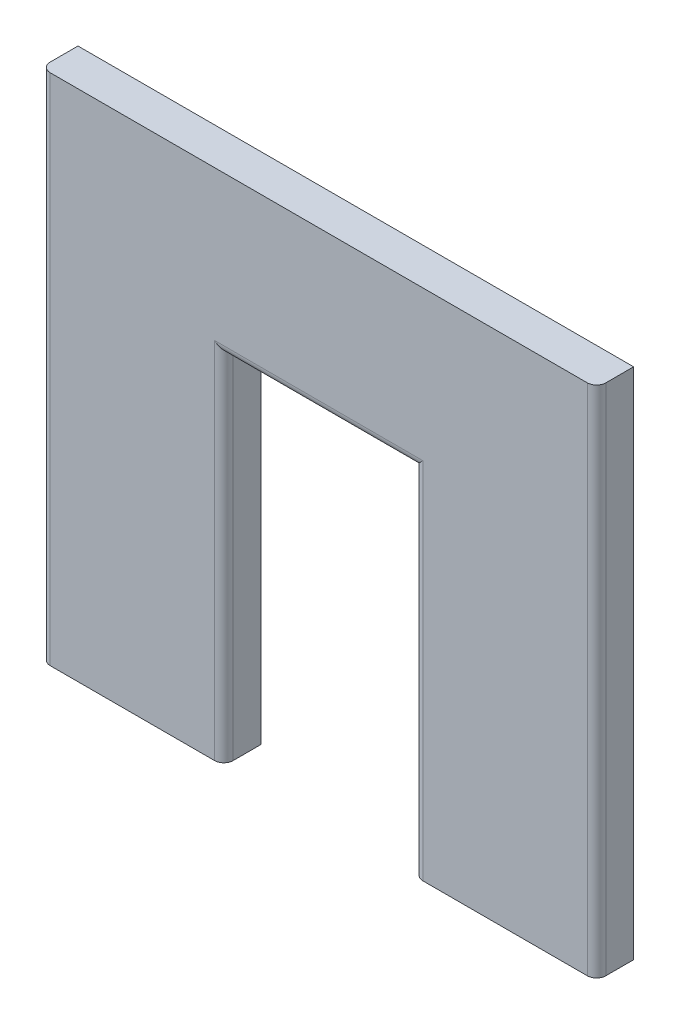
ISO-10303-21;
HEADER;
FILE_DESCRIPTION(('STEP AP214'),'2;1');
FILE_NAME('part.step','',(''),(''),'','','');
FILE_SCHEMA(('AUTOMOTIVE_DESIGN { 1 0 10303 214 1 1 1 1 }'));
ENDSEC;
DATA;
#1=APPLICATION_CONTEXT('core data for automotive mechanical design processes');
#2=APPLICATION_PROTOCOL_DEFINITION('international standard','automotive_design',2000,#1);
#3=PRODUCT_CONTEXT('',#1,'mechanical');
#4=PRODUCT('Part','Part','',(#3));
#5=PRODUCT_RELATED_PRODUCT_CATEGORY('part','',(#4));
#6=PRODUCT_DEFINITION_FORMATION('','',#4);
#7=PRODUCT_DEFINITION_CONTEXT('part definition',#1,'design');
#8=PRODUCT_DEFINITION('design','',#6,#7);
#9=PRODUCT_DEFINITION_SHAPE('','',#8);
#10=(LENGTH_UNIT() NAMED_UNIT(*) SI_UNIT(.MILLI.,.METRE.));
#11=(NAMED_UNIT(*) PLANE_ANGLE_UNIT() SI_UNIT($,.RADIAN.));
#12=(NAMED_UNIT(*) SI_UNIT($,.STERADIAN.) SOLID_ANGLE_UNIT());
#13=UNCERTAINTY_MEASURE_WITH_UNIT(LENGTH_MEASURE(1.E-05),#10,'distance_accuracy_value','');
#14=(GEOMETRIC_REPRESENTATION_CONTEXT(3) GLOBAL_UNCERTAINTY_ASSIGNED_CONTEXT((#13)) GLOBAL_UNIT_ASSIGNED_CONTEXT((#10,
#11,#12)) REPRESENTATION_CONTEXT('',''));
#15=CARTESIAN_POINT('',(0.,0.,0.));
#16=DIRECTION('',(0.,0.,1.));
#17=DIRECTION('',(1.,0.,0.));
#18=AXIS2_PLACEMENT_3D('',#15,#16,#17);
#19=CARTESIAN_POINT('',(-15.,-13.8636363636364,2.));
#20=DIRECTION('',(0.,1.,0.));
#21=DIRECTION('',(0.,0.,1.));
#22=AXIS2_PLACEMENT_3D('',#19,#20,#21);
#23=PLANE('',#22);
#24=DIRECTION('',(0.,0.,1.));
#25=VECTOR('',#24,1.);
#26=CARTESIAN_POINT('',(-5.12444720417668,-13.8636363636364,2.));
#27=LINE('',#26,#25);
#28=CARTESIAN_POINT('',(-5.12444720417668,-13.8636363636364,0.));
#29=VERTEX_POINT('',#28);
#30=CARTESIAN_POINT('',(-5.12444720417668,-13.8636363636364,1.5));
#31=VERTEX_POINT('',#30);
#32=EDGE_CURVE('E141',#29,#31,#27,.T.);
#33=ORIENTED_EDGE('',*,*,#32,.T.);
#34=CARTESIAN_POINT('',(-5.62444720417668,-13.8636363636364,1.5));
#35=DIRECTION('',(0.,1.,0.));
#36=DIRECTION('',(0.,0.,1.));
#37=AXIS2_PLACEMENT_3D('',#34,#35,#36);
#38=CIRCLE('',#37,0.5);
#39=CARTESIAN_POINT('',(-5.62444720417668,-13.8636363636364,2.));
#40=VERTEX_POINT('',#39);
#41=EDGE_CURVE('E204',#31,#40,#38,.F.);
#42=ORIENTED_EDGE('',*,*,#41,.T.);
#43=DIRECTION('',(1.,0.,0.));
#44=VECTOR('',#43,1.);
#45=CARTESIAN_POINT('',(-15.,-13.8636363636364,2.));
#46=LINE('',#45,#44);
#47=CARTESIAN_POINT('',(-14.5,-13.8636363636364,2.));
#48=VERTEX_POINT('',#47);
#49=EDGE_CURVE('E161',#48,#40,#46,.T.);
#50=ORIENTED_EDGE('',*,*,#49,.F.);
#51=CARTESIAN_POINT('',(-14.5,-13.8636363636364,1.5));
#52=DIRECTION('',(0.,1.,0.));
#53=DIRECTION('',(0.,0.,1.));
#54=AXIS2_PLACEMENT_3D('',#51,#52,#53);
#55=CIRCLE('',#54,0.5);
#56=CARTESIAN_POINT('',(-15.,-13.8636363636364,1.5));
#57=VERTEX_POINT('',#56);
#58=EDGE_CURVE('E185',#48,#57,#55,.F.);
#59=ORIENTED_EDGE('',*,*,#58,.T.);
#60=DIRECTION('',(0.,0.,-1.));
#61=VECTOR('',#60,1.);
#62=CARTESIAN_POINT('',(-15.,-13.8636363636364,2.));
#63=LINE('',#62,#61);
#64=CARTESIAN_POINT('',(-15.,-13.8636363636364,0.));
#65=VERTEX_POINT('',#64);
#66=EDGE_CURVE('E175',#57,#65,#63,.T.);
#67=ORIENTED_EDGE('',*,*,#66,.T.);
#68=DIRECTION('',(1.,0.,0.));
#69=VECTOR('',#68,1.);
#70=CARTESIAN_POINT('',(-15.,-13.8636363636364,0.));
#71=LINE('',#70,#69);
#72=EDGE_CURVE('E160',#65,#29,#71,.T.);
#73=ORIENTED_EDGE('',*,*,#72,.T.);
#74=EDGE_LOOP('',(#33,#42,#50,#59,#67,#73));
#75=FACE_BOUND('',#74,.T.);
#76=ADVANCED_FACE('F33',(#75),#23,.F.);
#77=CARTESIAN_POINT('',(15.,-13.8636363636364,2.));
#78=DIRECTION('',(-1.,0.,0.));
#79=DIRECTION('',(0.,0.,1.));
#80=AXIS2_PLACEMENT_3D('',#77,#78,#79);
#81=PLANE('',#80);
#82=DIRECTION('',(0.,0.,-1.));
#83=VECTOR('',#82,1.);
#84=CARTESIAN_POINT('',(15.,13.8636363636364,2.));
#85=LINE('',#84,#83);
#86=CARTESIAN_POINT('',(15.,13.8636363636364,1.5));
#87=VERTEX_POINT('',#86);
#88=CARTESIAN_POINT('',(15.,13.8636363636364,0.));
#89=VERTEX_POINT('',#88);
#90=EDGE_CURVE('E179',#87,#89,#85,.T.);
#91=ORIENTED_EDGE('',*,*,#90,.F.);
#92=DIRECTION('',(0.,1.,0.));
#93=VECTOR('',#92,1.);
#94=CARTESIAN_POINT('',(15.,-13.8636363636364,1.5));
#95=LINE('',#94,#93);
#96=CARTESIAN_POINT('',(15.,-13.8636363636364,1.5));
#97=VERTEX_POINT('',#96);
#98=EDGE_CURVE('E197',#87,#97,#95,.F.);
#99=ORIENTED_EDGE('',*,*,#98,.T.);
#100=DIRECTION('',(0.,0.,-1.));
#101=VECTOR('',#100,1.);
#102=CARTESIAN_POINT('',(15.,-13.8636363636364,2.));
#103=LINE('',#102,#101);
#104=CARTESIAN_POINT('',(15.,-13.8636363636364,0.));
#105=VERTEX_POINT('',#104);
#106=EDGE_CURVE('E163',#97,#105,#103,.T.);
#107=ORIENTED_EDGE('',*,*,#106,.T.);
#108=DIRECTION('',(0.,1.,0.));
#109=VECTOR('',#108,1.);
#110=CARTESIAN_POINT('',(15.,-13.8636363636364,0.));
#111=LINE('',#110,#109);
#112=EDGE_CURVE('E156',#105,#89,#111,.T.);
#113=ORIENTED_EDGE('',*,*,#112,.T.);
#114=EDGE_LOOP('',(#91,#99,#107,#113));
#115=FACE_BOUND('',#114,.T.);
#116=ADVANCED_FACE('F238',(#115),#81,.F.);
#117=CARTESIAN_POINT('',(-15.,13.8636363636364,2.));
#118=DIRECTION('',(0.,-1.,0.));
#119=DIRECTION('',(0.,0.,-1.));
#120=AXIS2_PLACEMENT_3D('',#117,#118,#119);
#121=PLANE('',#120);
#122=DIRECTION('',(-1.,0.,0.));
#123=VECTOR('',#122,1.);
#124=CARTESIAN_POINT('',(-15.,13.8636363636364,2.));
#125=LINE('',#124,#123);
#126=CARTESIAN_POINT('',(14.5,13.8636363636364,2.));
#127=VERTEX_POINT('',#126);
#128=CARTESIAN_POINT('',(-14.5,13.8636363636364,2.));
#129=VERTEX_POINT('',#128);
#130=EDGE_CURVE('E157',#127,#129,#125,.T.);
#131=ORIENTED_EDGE('',*,*,#130,.F.);
#132=CARTESIAN_POINT('',(14.5,13.8636363636364,1.5));
#133=DIRECTION('',(0.,-1.,0.));
#134=DIRECTION('',(0.,0.,-1.));
#135=AXIS2_PLACEMENT_3D('',#132,#133,#134);
#136=CIRCLE('',#135,0.5);
#137=EDGE_CURVE('E195',#127,#87,#136,.F.);
#138=ORIENTED_EDGE('',*,*,#137,.T.);
#139=ORIENTED_EDGE('',*,*,#90,.T.);
#140=DIRECTION('',(-1.,0.,0.));
#141=VECTOR('',#140,1.);
#142=CARTESIAN_POINT('',(-15.,13.8636363636364,0.));
#143=LINE('',#142,#141);
#144=CARTESIAN_POINT('',(-15.,13.8636363636364,0.));
#145=VERTEX_POINT('',#144);
#146=EDGE_CURVE('E166',#89,#145,#143,.T.);
#147=ORIENTED_EDGE('',*,*,#146,.T.);
#148=DIRECTION('',(0.,0.,-1.));
#149=VECTOR('',#148,1.);
#150=CARTESIAN_POINT('',(-15.,13.8636363636364,2.));
#151=LINE('',#150,#149);
#152=CARTESIAN_POINT('',(-15.,13.8636363636364,1.5));
#153=VERTEX_POINT('',#152);
#154=EDGE_CURVE('E177',#153,#145,#151,.T.);
#155=ORIENTED_EDGE('',*,*,#154,.F.);
#156=CARTESIAN_POINT('',(-14.5,13.8636363636364,1.5));
#157=DIRECTION('',(0.,-1.,0.));
#158=DIRECTION('',(0.,0.,-1.));
#159=AXIS2_PLACEMENT_3D('',#156,#157,#158);
#160=CIRCLE('',#159,0.5);
#161=EDGE_CURVE('E189',#153,#129,#160,.F.);
#162=ORIENTED_EDGE('',*,*,#161,.T.);
#163=EDGE_LOOP('',(#131,#138,#139,#147,#155,#162));
#164=FACE_BOUND('',#163,.T.);
#165=ADVANCED_FACE('F244',(#164),#121,.F.);
#166=CARTESIAN_POINT('',(-15.,-13.8636363636364,2.));
#167=DIRECTION('',(1.,0.,0.));
#168=DIRECTION('',(0.,0.,-1.));
#169=AXIS2_PLACEMENT_3D('',#166,#167,#168);
#170=PLANE('',#169);
#171=ORIENTED_EDGE('',*,*,#66,.F.);
#172=DIRECTION('',(0.,-1.,0.));
#173=VECTOR('',#172,1.);
#174=CARTESIAN_POINT('',(-15.,-13.8636363636364,1.5));
#175=LINE('',#174,#173);
#176=EDGE_CURVE('E187',#57,#153,#175,.F.);
#177=ORIENTED_EDGE('',*,*,#176,.T.);
#178=ORIENTED_EDGE('',*,*,#154,.T.);
#179=DIRECTION('',(0.,-1.,0.));
#180=VECTOR('',#179,1.);
#181=CARTESIAN_POINT('',(-15.,-13.8636363636364,0.));
#182=LINE('',#181,#180);
#183=EDGE_CURVE('E169',#145,#65,#182,.T.);
#184=ORIENTED_EDGE('',*,*,#183,.T.);
#185=EDGE_LOOP('',(#171,#177,#178,#184));
#186=FACE_BOUND('',#185,.T.);
#187=ADVANCED_FACE('F255',(#186),#170,.F.);
#188=CARTESIAN_POINT('',(5.62444720417668,-13.8636363636364,2.));
#189=VERTEX_POINT('',#188);
#190=CARTESIAN_POINT('',(14.5,-13.8636363636364,2.));
#191=VERTEX_POINT('',#190);
#192=EDGE_CURVE('E159',#189,#191,#46,.T.);
#193=ORIENTED_EDGE('',*,*,#192,.F.);
#194=CARTESIAN_POINT('',(5.62444720417668,-13.8636363636364,1.5));
#195=DIRECTION('',(0.,1.,0.));
#196=DIRECTION('',(0.,0.,1.));
#197=AXIS2_PLACEMENT_3D('',#194,#195,#196);
#198=CIRCLE('',#197,0.5);
#199=CARTESIAN_POINT('',(5.12444720417668,-13.8636363636364,1.5));
#200=VERTEX_POINT('',#199);
#201=EDGE_CURVE('E211',#189,#200,#198,.F.);
#202=ORIENTED_EDGE('',*,*,#201,.T.);
#203=DIRECTION('',(0.,0.,-1.));
#204=VECTOR('',#203,1.);
#205=CARTESIAN_POINT('',(5.12444720417668,-13.8636363636364,2.));
#206=LINE('',#205,#204);
#207=CARTESIAN_POINT('',(5.12444720417668,-13.8636363636364,0.));
#208=VERTEX_POINT('',#207);
#209=EDGE_CURVE('E134',#200,#208,#206,.T.);
#210=ORIENTED_EDGE('',*,*,#209,.T.);
#211=EDGE_CURVE('E172',#208,#105,#71,.T.);
#212=ORIENTED_EDGE('',*,*,#211,.T.);
#213=ORIENTED_EDGE('',*,*,#106,.F.);
#214=CARTESIAN_POINT('',(14.5,-13.8636363636364,1.5));
#215=DIRECTION('',(0.,1.,0.));
#216=DIRECTION('',(0.,0.,1.));
#217=AXIS2_PLACEMENT_3D('',#214,#215,#216);
#218=CIRCLE('',#217,0.5);
#219=EDGE_CURVE('E199',#97,#191,#218,.F.);
#220=ORIENTED_EDGE('',*,*,#219,.T.);
#221=EDGE_LOOP('',(#193,#202,#210,#212,#213,#220));
#222=FACE_BOUND('',#221,.T.);
#223=ADVANCED_FACE('F223',(#222),#23,.F.);
#224=CARTESIAN_POINT('',(0.,0.,2.));
#225=DIRECTION('',(0.,0.,-1.));
#226=DIRECTION('',(-1.,0.,0.));
#227=AXIS2_PLACEMENT_3D('',#224,#225,#226);
#228=PLANE('',#227);
#229=DIRECTION('',(0.,-1.,0.));
#230=VECTOR('',#229,1.);
#231=CARTESIAN_POINT('',(-5.62444720417668,0.,2.));
#232=LINE('',#231,#230);
#233=CARTESIAN_POINT('',(-5.62444720417668,5.78374063718961,2.));
#234=VERTEX_POINT('',#233);
#235=EDGE_CURVE('E48',#40,#234,#232,.F.);
#236=ORIENTED_EDGE('',*,*,#235,.T.);
#237=DIRECTION('',(-1.,0.,0.));
#238=VECTOR('',#237,1.);
#239=CARTESIAN_POINT('',(0.,5.78374063718961,2.));
#240=LINE('',#239,#238);
#241=CARTESIAN_POINT('',(5.62444720417668,5.78374063718961,2.));
#242=VERTEX_POINT('',#241);
#243=EDGE_CURVE('E214',#234,#242,#240,.F.);
#244=ORIENTED_EDGE('',*,*,#243,.T.);
#245=DIRECTION('',(0.,1.,0.));
#246=VECTOR('',#245,1.);
#247=CARTESIAN_POINT('',(5.62444720417668,0.,2.));
#248=LINE('',#247,#246);
#249=EDGE_CURVE('E55',#242,#189,#248,.F.);
#250=ORIENTED_EDGE('',*,*,#249,.T.);
#251=ORIENTED_EDGE('',*,*,#192,.T.);
#252=DIRECTION('',(0.,1.,0.));
#253=VECTOR('',#252,1.);
#254=CARTESIAN_POINT('',(14.5,0.,2.));
#255=LINE('',#254,#253);
#256=EDGE_CURVE('E192',#191,#127,#255,.T.);
#257=ORIENTED_EDGE('',*,*,#256,.T.);
#258=ORIENTED_EDGE('',*,*,#130,.T.);
#259=DIRECTION('',(0.,-1.,0.));
#260=VECTOR('',#259,1.);
#261=CARTESIAN_POINT('',(-14.5,0.,2.));
#262=LINE('',#261,#260);
#263=EDGE_CURVE('E182',#129,#48,#262,.T.);
#264=ORIENTED_EDGE('',*,*,#263,.T.);
#265=ORIENTED_EDGE('',*,*,#49,.T.);
#266=EDGE_LOOP('',(#236,#244,#250,#251,#257,#258,#264,#265));
#267=FACE_BOUND('',#266,.T.);
#268=ADVANCED_FACE('F220',(#267),#228,.F.);
#269=CARTESIAN_POINT('',(0.,0.,0.));
#270=DIRECTION('',(0.,0.,-1.));
#271=DIRECTION('',(-1.,0.,0.));
#272=AXIS2_PLACEMENT_3D('',#269,#270,#271);
#273=PLANE('',#272);
#274=DIRECTION('',(0.,-1.,0.));
#275=VECTOR('',#274,1.);
#276=CARTESIAN_POINT('',(-5.12444720417668,-13.8722928339697,0.));
#277=LINE('',#276,#275);
#278=CARTESIAN_POINT('',(-5.12444720417668,5.28374063718961,0.));
#279=VERTEX_POINT('',#278);
#280=EDGE_CURVE('E138',#279,#29,#277,.T.);
#281=ORIENTED_EDGE('',*,*,#280,.T.);
#282=ORIENTED_EDGE('',*,*,#72,.F.);
#283=ORIENTED_EDGE('',*,*,#183,.F.);
#284=ORIENTED_EDGE('',*,*,#146,.F.);
#285=ORIENTED_EDGE('',*,*,#112,.F.);
#286=ORIENTED_EDGE('',*,*,#211,.F.);
#287=DIRECTION('',(0.,-1.,0.));
#288=VECTOR('',#287,1.);
#289=CARTESIAN_POINT('',(5.12444720417668,0.,0.));
#290=LINE('',#289,#288);
#291=CARTESIAN_POINT('',(5.12444720417668,5.28374063718961,0.));
#292=VERTEX_POINT('',#291);
#293=EDGE_CURVE('E150',#292,#208,#290,.T.);
#294=ORIENTED_EDGE('',*,*,#293,.F.);
#295=DIRECTION('',(-1.,0.,0.));
#296=VECTOR('',#295,1.);
#297=CARTESIAN_POINT('',(5.12444720417668,5.28374063718961,0.));
#298=LINE('',#297,#296);
#299=EDGE_CURVE('E127',#292,#279,#298,.T.);
#300=ORIENTED_EDGE('',*,*,#299,.T.);
#301=EDGE_LOOP('',(#281,#282,#283,#284,#285,#286,#294,#300));
#302=FACE_BOUND('',#301,.T.);
#303=ADVANCED_FACE('F147',(#302),#273,.T.);
#304=CARTESIAN_POINT('',(-5.12444720417668,-13.8722928339697,0.));
#305=DIRECTION('',(-1.,0.,0.));
#306=DIRECTION('',(0.,0.,1.));
#307=AXIS2_PLACEMENT_3D('',#304,#305,#306);
#308=PLANE('',#307);
#309=DIRECTION('',(0.,0.,1.));
#310=VECTOR('',#309,1.);
#311=CARTESIAN_POINT('',(-5.12444720417668,5.28374063718961,0.));
#312=LINE('',#311,#310);
#313=CARTESIAN_POINT('',(-5.12444720417668,5.28374063718961,1.5));
#314=VERTEX_POINT('',#313);
#315=EDGE_CURVE('E122',#279,#314,#312,.T.);
#316=ORIENTED_EDGE('',*,*,#315,.T.);
#317=DIRECTION('',(0.,-1.,0.));
#318=VECTOR('',#317,1.);
#319=CARTESIAN_POINT('',(-5.12444720417668,-13.8722928339697,1.5));
#320=LINE('',#319,#318);
#321=EDGE_CURVE('E202',#314,#31,#320,.T.);
#322=ORIENTED_EDGE('',*,*,#321,.T.);
#323=ORIENTED_EDGE('',*,*,#32,.F.);
#324=ORIENTED_EDGE('',*,*,#280,.F.);
#325=EDGE_LOOP('',(#316,#322,#323,#324));
#326=FACE_BOUND('',#325,.T.);
#327=ADVANCED_FACE('F139',(#326),#308,.F.);
#328=CARTESIAN_POINT('',(5.12444720417668,-13.8722928339697,0.));
#329=DIRECTION('',(1.,0.,0.));
#330=DIRECTION('',(0.,0.,-1.));
#331=AXIS2_PLACEMENT_3D('',#328,#329,#330);
#332=PLANE('',#331);
#333=ORIENTED_EDGE('',*,*,#209,.F.);
#334=DIRECTION('',(0.,1.,0.));
#335=VECTOR('',#334,1.);
#336=CARTESIAN_POINT('',(5.12444720417668,-13.8722928339697,1.5));
#337=LINE('',#336,#335);
#338=CARTESIAN_POINT('',(5.12444720417668,5.28374063718961,1.5));
#339=VERTEX_POINT('',#338);
#340=EDGE_CURVE('E207',#200,#339,#337,.T.);
#341=ORIENTED_EDGE('',*,*,#340,.T.);
#342=DIRECTION('',(0.,0.,1.));
#343=VECTOR('',#342,1.);
#344=CARTESIAN_POINT('',(5.12444720417668,5.28374063718961,0.));
#345=LINE('',#344,#343);
#346=EDGE_CURVE('E135',#292,#339,#345,.T.);
#347=ORIENTED_EDGE('',*,*,#346,.F.);
#348=ORIENTED_EDGE('',*,*,#293,.T.);
#349=EDGE_LOOP('',(#333,#341,#347,#348));
#350=FACE_BOUND('',#349,.T.);
#351=ADVANCED_FACE('F231',(#350),#332,.F.);
#352=CARTESIAN_POINT('',(5.12444720417668,5.28374063718961,0.));
#353=DIRECTION('',(0.,1.,0.));
#354=DIRECTION('',(-1.,0.,0.));
#355=AXIS2_PLACEMENT_3D('',#352,#353,#354);
#356=PLANE('',#355);
#357=ORIENTED_EDGE('',*,*,#346,.T.);
#358=DIRECTION('',(-1.,0.,0.));
#359=VECTOR('',#358,1.);
#360=CARTESIAN_POINT('',(5.12444720417668,5.28374063718961,1.5));
#361=LINE('',#360,#359);
#362=EDGE_CURVE('E130',#339,#314,#361,.T.);
#363=ORIENTED_EDGE('',*,*,#362,.T.);
#364=ORIENTED_EDGE('',*,*,#315,.F.);
#365=ORIENTED_EDGE('',*,*,#299,.F.);
#366=EDGE_LOOP('',(#357,#363,#364,#365));
#367=FACE_BOUND('',#366,.T.);
#368=ADVANCED_FACE('F125',(#367),#356,.F.);
#369=CARTESIAN_POINT('',(-14.5,0.,1.5));
#370=DIRECTION('',(0.,-1.,0.));
#371=DIRECTION('',(0.,0.,-1.));
#372=AXIS2_PLACEMENT_3D('',#369,#370,#371);
#373=CYLINDRICAL_SURFACE('',#372,0.5);
#374=ORIENTED_EDGE('',*,*,#161,.F.);
#375=ORIENTED_EDGE('',*,*,#176,.F.);
#376=ORIENTED_EDGE('',*,*,#58,.F.);
#377=ORIENTED_EDGE('',*,*,#263,.F.);
#378=EDGE_LOOP('',(#374,#375,#376,#377));
#379=FACE_BOUND('',#378,.T.);
#380=ADVANCED_FACE('F250',(#379),#373,.T.);
#381=CARTESIAN_POINT('',(14.5,0.,1.5));
#382=DIRECTION('',(0.,1.,0.));
#383=DIRECTION('',(0.,0.,1.));
#384=AXIS2_PLACEMENT_3D('',#381,#382,#383);
#385=CYLINDRICAL_SURFACE('',#384,0.5);
#386=ORIENTED_EDGE('',*,*,#219,.F.);
#387=ORIENTED_EDGE('',*,*,#98,.F.);
#388=ORIENTED_EDGE('',*,*,#137,.F.);
#389=ORIENTED_EDGE('',*,*,#256,.F.);
#390=EDGE_LOOP('',(#386,#387,#388,#389));
#391=FACE_BOUND('',#390,.T.);
#392=ADVANCED_FACE('F241',(#391),#385,.T.);
#393=CARTESIAN_POINT('',(-5.62444720417668,-13.8722928339697,1.5));
#394=DIRECTION('',(0.,-1.,0.));
#395=DIRECTION('',(0.,0.,-1.));
#396=AXIS2_PLACEMENT_3D('',#393,#394,#395);
#397=CYLINDRICAL_SURFACE('',#396,0.5);
#398=ORIENTED_EDGE('',*,*,#321,.F.);
#399=CARTESIAN_POINT('',(-5.62444720417668,5.78374063718961,1.5));
#400=DIRECTION('',(-0.707106781186547,-0.707106781186547,0.));
#401=DIRECTION('',(-0.707106781186548,0.707106781186547,0.));
#402=AXIS2_PLACEMENT_3D('',#399,#400,#401);
#403=ELLIPSE('',#402,0.707106781186547,0.5);
#404=EDGE_CURVE('E41',#314,#234,#403,.T.);
#405=ORIENTED_EDGE('',*,*,#404,.T.);
#406=ORIENTED_EDGE('',*,*,#235,.F.);
#407=ORIENTED_EDGE('',*,*,#41,.F.);
#408=EDGE_LOOP('',(#398,#405,#406,#407));
#409=FACE_BOUND('',#408,.T.);
#410=ADVANCED_FACE('F217',(#409),#397,.T.);
#411=CARTESIAN_POINT('',(5.62444720417668,-13.8722928339697,1.5));
#412=DIRECTION('',(0.,1.,0.));
#413=DIRECTION('',(0.,0.,1.));
#414=AXIS2_PLACEMENT_3D('',#411,#412,#413);
#415=CYLINDRICAL_SURFACE('',#414,0.5);
#416=ORIENTED_EDGE('',*,*,#201,.F.);
#417=ORIENTED_EDGE('',*,*,#249,.F.);
#418=CARTESIAN_POINT('',(5.62444720417668,5.78374063718961,1.5));
#419=DIRECTION('',(-0.707106781186548,0.707106781186547,0.));
#420=DIRECTION('',(-0.707106781186547,-0.707106781186547,0.));
#421=AXIS2_PLACEMENT_3D('',#418,#419,#420);
#422=ELLIPSE('',#421,0.707106781186548,0.5);
#423=EDGE_CURVE('E11',#242,#339,#422,.F.);
#424=ORIENTED_EDGE('',*,*,#423,.T.);
#425=ORIENTED_EDGE('',*,*,#340,.F.);
#426=EDGE_LOOP('',(#416,#417,#424,#425));
#427=FACE_BOUND('',#426,.T.);
#428=ADVANCED_FACE('F229',(#427),#415,.T.);
#429=CARTESIAN_POINT('',(5.12444720417668,5.78374063718961,1.5));
#430=DIRECTION('',(-1.,0.,0.));
#431=DIRECTION('',(0.,-1.,0.));
#432=AXIS2_PLACEMENT_3D('',#429,#430,#431);
#433=CYLINDRICAL_SURFACE('',#432,0.5);
#434=ORIENTED_EDGE('',*,*,#423,.F.);
#435=ORIENTED_EDGE('',*,*,#243,.F.);
#436=ORIENTED_EDGE('',*,*,#404,.F.);
#437=ORIENTED_EDGE('',*,*,#362,.F.);
#438=EDGE_LOOP('',(#434,#435,#436,#437));
#439=FACE_BOUND('',#438,.T.);
#440=ADVANCED_FACE('F35',(#439),#433,.T.);
#441=CLOSED_SHELL('',(#76,#116,#165,#187,#223,#268,#303,#327,#351,#368,#380,#392,#410,#428,#440));
#442=MANIFOLD_SOLID_BREP('B2',#441);
#443=ADVANCED_BREP_SHAPE_REPRESENTATION('',(#18,#442),#14);
#444=SHAPE_DEFINITION_REPRESENTATION(#9,#443);
ENDSEC;
END-ISO-10303-21;
